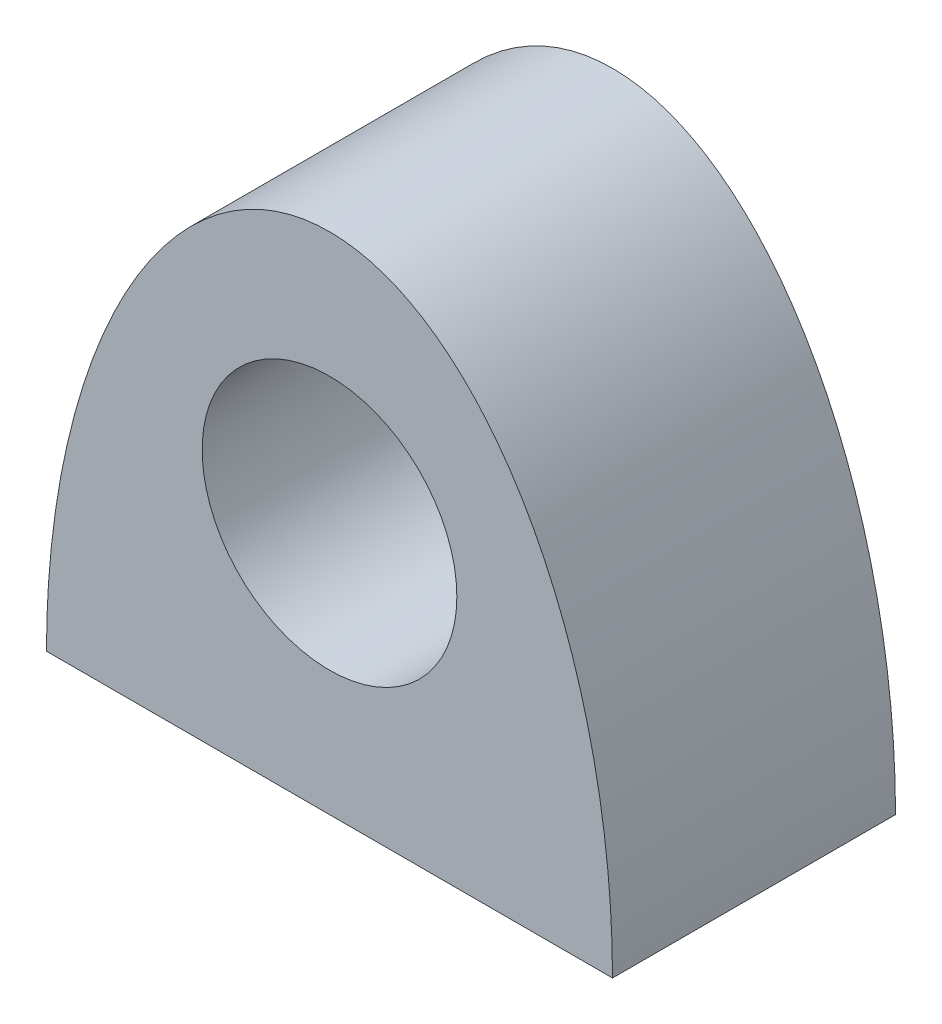
ISO-10303-21;
HEADER;
FILE_DESCRIPTION(('STEP AP214'),'2;1');
FILE_NAME('part.step','',(''),(''),'','','');
FILE_SCHEMA(('AUTOMOTIVE_DESIGN { 1 0 10303 214 1 1 1 1 }'));
ENDSEC;
DATA;
#1=APPLICATION_CONTEXT('core data for automotive mechanical design processes');
#2=APPLICATION_PROTOCOL_DEFINITION('international standard','automotive_design',2000,#1);
#3=PRODUCT_CONTEXT('',#1,'mechanical');
#4=PRODUCT('Part','Part','',(#3));
#5=PRODUCT_RELATED_PRODUCT_CATEGORY('part','',(#4));
#6=PRODUCT_DEFINITION_FORMATION('','',#4);
#7=PRODUCT_DEFINITION_CONTEXT('part definition',#1,'design');
#8=PRODUCT_DEFINITION('design','',#6,#7);
#9=PRODUCT_DEFINITION_SHAPE('','',#8);
#10=(LENGTH_UNIT() NAMED_UNIT(*) SI_UNIT(.MILLI.,.METRE.));
#11=(NAMED_UNIT(*) PLANE_ANGLE_UNIT() SI_UNIT($,.RADIAN.));
#12=(NAMED_UNIT(*) SI_UNIT($,.STERADIAN.) SOLID_ANGLE_UNIT());
#13=UNCERTAINTY_MEASURE_WITH_UNIT(LENGTH_MEASURE(1.E-05),#10,'distance_accuracy_value','');
#14=(GEOMETRIC_REPRESENTATION_CONTEXT(3) GLOBAL_UNCERTAINTY_ASSIGNED_CONTEXT((#13)) GLOBAL_UNIT_ASSIGNED_CONTEXT((#10,
#11,#12)) REPRESENTATION_CONTEXT('',''));
#15=CARTESIAN_POINT('',(0.,0.,0.));
#16=DIRECTION('',(0.,0.,1.));
#17=DIRECTION('',(1.,0.,0.));
#18=AXIS2_PLACEMENT_3D('',#15,#16,#17);
#19=CARTESIAN_POINT('',(3.,0.,3.));
#20=DIRECTION('',(0.,0.,1.));
#21=DIRECTION('',(1.,0.,0.));
#22=AXIS2_PLACEMENT_3D('',#19,#20,#21);
#23=PLANE('',#22);
#24=CARTESIAN_POINT('',(3.,0.,3.));
#25=DIRECTION('',(0.,0.,1.));
#26=DIRECTION('',(0.,-1.,0.));
#27=AXIS2_PLACEMENT_3D('',#24,#25,#26);
#28=ELLIPSE('',#27,5.35135135135135,3.);
#29=CARTESIAN_POINT('',(6.,0.,3.));
#30=VERTEX_POINT('',#29);
#31=CARTESIAN_POINT('',(0.,0.,3.));
#32=VERTEX_POINT('',#31);
#33=EDGE_CURVE('E73',#30,#32,#28,.T.);
#34=ORIENTED_EDGE('',*,*,#33,.T.);
#35=DIRECTION('',(1.,0.,0.));
#36=VECTOR('',#35,1.);
#37=CARTESIAN_POINT('',(0.,0.,3.));
#38=LINE('',#37,#36);
#39=EDGE_CURVE('E57',#32,#30,#38,.T.);
#40=ORIENTED_EDGE('',*,*,#39,.T.);
#41=EDGE_LOOP('',(#34,#40));
#42=FACE_BOUND('',#41,.T.);
#43=CARTESIAN_POINT('',(2.99999999999999,2.67567567567567,3.));
#44=DIRECTION('',(0.,0.,1.));
#45=DIRECTION('',(1.,0.,0.));
#46=AXIS2_PLACEMENT_3D('',#43,#44,#45);
#47=CIRCLE('',#46,1.35);
#48=CARTESIAN_POINT('',(4.34999999999999,2.67567567567567,3.));
#49=VERTEX_POINT('',#48);
#50=EDGE_CURVE('E81',#49,#49,#47,.T.);
#51=ORIENTED_EDGE('',*,*,#50,.F.);
#52=EDGE_LOOP('',(#51));
#53=FACE_BOUND('',#52,.T.);
#54=ADVANCED_FACE('F39',(#42,#53),#23,.T.);
#55=CARTESIAN_POINT('',(3.,0.,0.));
#56=DIRECTION('',(0.,0.,1.));
#57=DIRECTION('',(1.,0.,0.));
#58=AXIS2_PLACEMENT_3D('',#55,#56,#57);
#59=PLANE('',#58);
#60=CARTESIAN_POINT('',(3.,0.,0.));
#61=DIRECTION('',(0.,0.,1.));
#62=DIRECTION('',(0.,-1.,0.));
#63=AXIS2_PLACEMENT_3D('',#60,#61,#62);
#64=ELLIPSE('',#63,5.35135135135135,3.);
#65=CARTESIAN_POINT('',(6.,0.,0.));
#66=VERTEX_POINT('',#65);
#67=CARTESIAN_POINT('',(0.,0.,0.));
#68=VERTEX_POINT('',#67);
#69=EDGE_CURVE('E74',#66,#68,#64,.T.);
#70=ORIENTED_EDGE('',*,*,#69,.F.);
#71=DIRECTION('',(1.,0.,0.));
#72=VECTOR('',#71,1.);
#73=CARTESIAN_POINT('',(0.,0.,0.));
#74=LINE('',#73,#72);
#75=EDGE_CURVE('E65',#68,#66,#74,.T.);
#76=ORIENTED_EDGE('',*,*,#75,.F.);
#77=EDGE_LOOP('',(#70,#76));
#78=FACE_BOUND('',#77,.T.);
#79=CARTESIAN_POINT('',(2.99999999999999,2.67567567567567,0.));
#80=DIRECTION('',(0.,0.,1.));
#81=DIRECTION('',(1.,0.,0.));
#82=AXIS2_PLACEMENT_3D('',#79,#80,#81);
#83=CIRCLE('',#82,1.35);
#84=CARTESIAN_POINT('',(4.34999999999999,2.67567567567567,0.));
#85=VERTEX_POINT('',#84);
#86=EDGE_CURVE('E85',#85,#85,#83,.T.);
#87=ORIENTED_EDGE('',*,*,#86,.T.);
#88=EDGE_LOOP('',(#87));
#89=FACE_BOUND('',#88,.T.);
#90=ADVANCED_FACE('F78',(#78,#89),#59,.F.);
#91=DIRECTION('',(0.,0.,-1.));
#92=VECTOR('',#91,1.);
#93=SURFACE_OF_LINEAR_EXTRUSION('',#28,#92);
#94=ORIENTED_EDGE('',*,*,#69,.T.);
#95=DIRECTION('',(0.,0.,-1.));
#96=VECTOR('',#95,1.);
#97=CARTESIAN_POINT('',(0.,0.,3.));
#98=LINE('',#97,#96);
#99=EDGE_CURVE('E11',#32,#68,#98,.T.);
#100=ORIENTED_EDGE('',*,*,#99,.F.);
#101=ORIENTED_EDGE('',*,*,#33,.F.);
#102=DIRECTION('',(0.,0.,-1.));
#103=VECTOR('',#102,1.);
#104=CARTESIAN_POINT('',(6.,0.,3.));
#105=LINE('',#104,#103);
#106=EDGE_CURVE('E50',#30,#66,#105,.T.);
#107=ORIENTED_EDGE('',*,*,#106,.T.);
#108=EDGE_LOOP('',(#94,#100,#101,#107));
#109=FACE_BOUND('',#108,.T.);
#110=ADVANCED_FACE('F41',(#109),#93,.F.);
#111=CARTESIAN_POINT('',(0.,0.,3.));
#112=DIRECTION('',(0.,1.,0.));
#113=DIRECTION('',(-1.,0.,0.));
#114=AXIS2_PLACEMENT_3D('',#111,#112,#113);
#115=PLANE('',#114);
#116=ORIENTED_EDGE('',*,*,#75,.T.);
#117=ORIENTED_EDGE('',*,*,#106,.F.);
#118=ORIENTED_EDGE('',*,*,#39,.F.);
#119=ORIENTED_EDGE('',*,*,#99,.T.);
#120=EDGE_LOOP('',(#116,#117,#118,#119));
#121=FACE_BOUND('',#120,.T.);
#122=ADVANCED_FACE('F68',(#121),#115,.F.);
#123=CARTESIAN_POINT('',(2.99999999999999,2.67567567567567,3.));
#124=DIRECTION('',(0.,0.,-1.));
#125=DIRECTION('',(-1.,0.,0.));
#126=AXIS2_PLACEMENT_3D('',#123,#124,#125);
#127=CYLINDRICAL_SURFACE('',#126,1.35);
#128=ORIENTED_EDGE('',*,*,#50,.T.);
#129=EDGE_LOOP('',(#128));
#130=FACE_BOUND('',#129,.T.);
#131=ORIENTED_EDGE('',*,*,#86,.F.);
#132=EDGE_LOOP('',(#131));
#133=FACE_BOUND('',#132,.T.);
#134=ADVANCED_FACE('F96',(#130,#133),#127,.F.);
#135=CLOSED_SHELL('',(#54,#90,#110,#122,#134));
#136=MANIFOLD_SOLID_BREP('B2',#135);
#137=ADVANCED_BREP_SHAPE_REPRESENTATION('',(#18,#136),#14);
#138=SHAPE_DEFINITION_REPRESENTATION(#9,#137);
ENDSEC;
END-ISO-10303-21;
